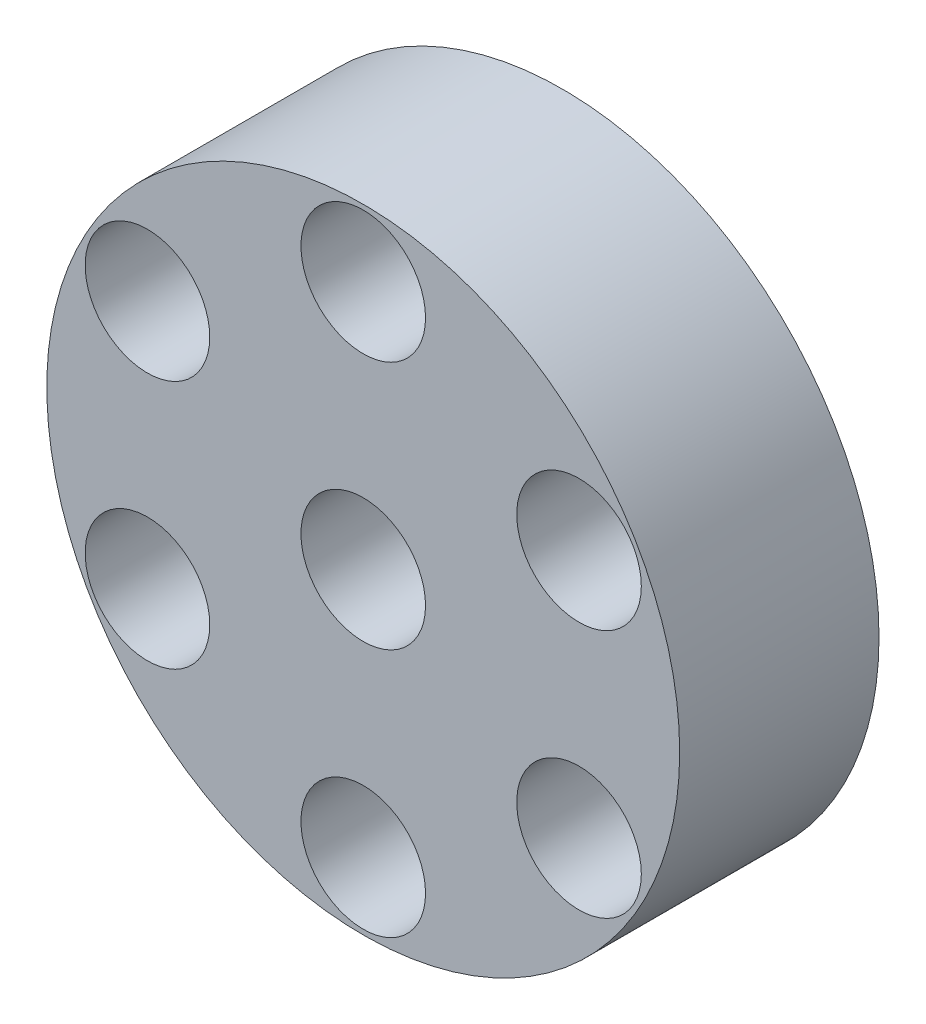
ISO-10303-21;
HEADER;
FILE_DESCRIPTION(('STEP AP214'),'2;1');
FILE_NAME('part.step','',(''),(''),'','','');
FILE_SCHEMA(('AUTOMOTIVE_DESIGN { 1 0 10303 214 1 1 1 1 }'));
ENDSEC;
DATA;
#1=APPLICATION_CONTEXT('core data for automotive mechanical design processes');
#2=APPLICATION_PROTOCOL_DEFINITION('international standard','automotive_design',2000,#1);
#3=PRODUCT_CONTEXT('',#1,'mechanical');
#4=PRODUCT('Part','Part','',(#3));
#5=PRODUCT_RELATED_PRODUCT_CATEGORY('part','',(#4));
#6=PRODUCT_DEFINITION_FORMATION('','',#4);
#7=PRODUCT_DEFINITION_CONTEXT('part definition',#1,'design');
#8=PRODUCT_DEFINITION('design','',#6,#7);
#9=PRODUCT_DEFINITION_SHAPE('','',#8);
#10=(LENGTH_UNIT() NAMED_UNIT(*) SI_UNIT(.MILLI.,.METRE.));
#11=(NAMED_UNIT(*) PLANE_ANGLE_UNIT() SI_UNIT($,.RADIAN.));
#12=(NAMED_UNIT(*) SI_UNIT($,.STERADIAN.) SOLID_ANGLE_UNIT());
#13=UNCERTAINTY_MEASURE_WITH_UNIT(LENGTH_MEASURE(1.E-05),#10,'distance_accuracy_value','');
#14=(GEOMETRIC_REPRESENTATION_CONTEXT(3) GLOBAL_UNCERTAINTY_ASSIGNED_CONTEXT((#13)) GLOBAL_UNIT_ASSIGNED_CONTEXT((#10,
#11,#12)) REPRESENTATION_CONTEXT('',''));
#15=CARTESIAN_POINT('',(0.,0.,0.));
#16=DIRECTION('',(0.,0.,1.));
#17=DIRECTION('',(1.,0.,0.));
#18=AXIS2_PLACEMENT_3D('',#15,#16,#17);
#19=CARTESIAN_POINT('',(0.,0.,8.));
#20=DIRECTION('',(0.,0.,-1.));
#21=DIRECTION('',(-1.,0.,0.));
#22=AXIS2_PLACEMENT_3D('',#19,#20,#21);
#23=CYLINDRICAL_SURFACE('',#22,12.7);
#24=CARTESIAN_POINT('',(0.,0.,8.));
#25=DIRECTION('',(0.,0.,1.));
#26=DIRECTION('',(1.,0.,0.));
#27=AXIS2_PLACEMENT_3D('',#24,#25,#26);
#28=CIRCLE('',#27,12.7);
#29=CARTESIAN_POINT('',(12.7,0.,8.));
#30=VERTEX_POINT('',#29);
#31=EDGE_CURVE('E10',#30,#30,#28,.T.);
#32=ORIENTED_EDGE('',*,*,#31,.F.);
#33=EDGE_LOOP('',(#32));
#34=FACE_BOUND('',#33,.T.);
#35=CARTESIAN_POINT('',(0.,0.,0.));
#36=DIRECTION('',(0.,0.,1.));
#37=DIRECTION('',(1.,0.,0.));
#38=AXIS2_PLACEMENT_3D('',#35,#36,#37);
#39=CIRCLE('',#38,12.7);
#40=CARTESIAN_POINT('',(12.7,0.,0.));
#41=VERTEX_POINT('',#40);
#42=EDGE_CURVE('E38',#41,#41,#39,.T.);
#43=ORIENTED_EDGE('',*,*,#42,.T.);
#44=EDGE_LOOP('',(#43));
#45=FACE_BOUND('',#44,.T.);
#46=ADVANCED_FACE('F35',(#34,#45),#23,.T.);
#47=CARTESIAN_POINT('',(0.,0.,8.));
#48=DIRECTION('',(0.,0.,1.));
#49=DIRECTION('',(1.,0.,0.));
#50=AXIS2_PLACEMENT_3D('',#47,#48,#49);
#51=PLANE('',#50);
#52=CARTESIAN_POINT('',(-8.66025403784425,4.99999999999975,8.));
#53=DIRECTION('',(0.,0.,1.));
#54=DIRECTION('',(1.,0.,0.));
#55=AXIS2_PLACEMENT_3D('',#52,#53,#54);
#56=CIRCLE('',#55,2.50000000000033);
#57=CARTESIAN_POINT('',(-6.16025403784392,4.99999999999975,8.));
#58=VERTEX_POINT('',#57);
#59=EDGE_CURVE('E56',#58,#58,#56,.T.);
#60=ORIENTED_EDGE('',*,*,#59,.F.);
#61=EDGE_LOOP('',(#60));
#62=FACE_BOUND('',#61,.T.);
#63=CARTESIAN_POINT('',(-8.66025403784396,-5.00000000000025,8.));
#64=DIRECTION('',(0.,0.,1.));
#65=DIRECTION('',(1.,0.,0.));
#66=AXIS2_PLACEMENT_3D('',#63,#64,#65);
#67=CIRCLE('',#66,2.50000000000057);
#68=CARTESIAN_POINT('',(-6.16025403784339,-5.00000000000025,8.));
#69=VERTEX_POINT('',#68);
#70=EDGE_CURVE('E62',#69,#69,#67,.T.);
#71=ORIENTED_EDGE('',*,*,#70,.F.);
#72=EDGE_LOOP('',(#71));
#73=FACE_BOUND('',#72,.T.);
#74=CARTESIAN_POINT('',(0.,0.,8.));
#75=DIRECTION('',(0.,0.,1.));
#76=DIRECTION('',(1.,0.,0.));
#77=AXIS2_PLACEMENT_3D('',#74,#75,#76);
#78=CIRCLE('',#77,2.5);
#79=CARTESIAN_POINT('',(2.5,0.,8.));
#80=VERTEX_POINT('',#79);
#81=EDGE_CURVE('E50',#80,#80,#78,.T.);
#82=ORIENTED_EDGE('',*,*,#81,.F.);
#83=EDGE_LOOP('',(#82));
#84=FACE_BOUND('',#83,.T.);
#85=CARTESIAN_POINT('',(8.66025403784453,5.00000000000025,8.));
#86=DIRECTION('',(0.,0.,1.));
#87=DIRECTION('',(1.,0.,0.));
#88=AXIS2_PLACEMENT_3D('',#85,#86,#87);
#89=CIRCLE('',#88,2.50000000000009);
#90=CARTESIAN_POINT('',(11.1602540378446,5.00000000000025,8.));
#91=VERTEX_POINT('',#90);
#92=EDGE_CURVE('E69',#91,#91,#89,.T.);
#93=ORIENTED_EDGE('',*,*,#92,.F.);
#94=EDGE_LOOP('',(#93));
#95=FACE_BOUND('',#94,.T.);
#96=CARTESIAN_POINT('',(8.66025403784481,-4.99999999999975,8.));
#97=DIRECTION('',(0.,0.,1.));
#98=DIRECTION('',(1.,0.,0.));
#99=AXIS2_PLACEMENT_3D('',#96,#97,#98);
#100=CIRCLE('',#99,2.50000000000038);
#101=CARTESIAN_POINT('',(11.1602540378452,-4.99999999999975,8.));
#102=VERTEX_POINT('',#101);
#103=EDGE_CURVE('E70',#102,#102,#100,.T.);
#104=ORIENTED_EDGE('',*,*,#103,.F.);
#105=EDGE_LOOP('',(#104));
#106=FACE_BOUND('',#105,.T.);
#107=CARTESIAN_POINT('',(5.65984895009786E-13,-10.,8.));
#108=DIRECTION('',(0.,0.,1.));
#109=DIRECTION('',(1.,0.,0.));
#110=AXIS2_PLACEMENT_3D('',#107,#108,#109);
#111=CIRCLE('',#110,2.50000000000061);
#112=CARTESIAN_POINT('',(2.50000000000118,-10.,8.));
#113=VERTEX_POINT('',#112);
#114=EDGE_CURVE('E80',#113,#113,#111,.T.);
#115=ORIENTED_EDGE('',*,*,#114,.F.);
#116=EDGE_LOOP('',(#115));
#117=FACE_BOUND('',#116,.T.);
#118=CARTESIAN_POINT('',(0.,10.,8.));
#119=DIRECTION('',(0.,0.,1.));
#120=DIRECTION('',(1.,0.,0.));
#121=AXIS2_PLACEMENT_3D('',#118,#119,#120);
#122=CIRCLE('',#121,2.5);
#123=CARTESIAN_POINT('',(2.5,10.,8.));
#124=VERTEX_POINT('',#123);
#125=EDGE_CURVE('E47',#124,#124,#122,.T.);
#126=ORIENTED_EDGE('',*,*,#125,.F.);
#127=EDGE_LOOP('',(#126));
#128=FACE_BOUND('',#127,.T.);
#129=ORIENTED_EDGE('',*,*,#31,.T.);
#130=EDGE_LOOP('',(#129));
#131=FACE_BOUND('',#130,.T.);
#132=ADVANCED_FACE('F91',(#62,#73,#84,#95,#106,#117,#128,#131),#51,.T.);
#133=CARTESIAN_POINT('',(0.,0.,0.));
#134=DIRECTION('',(0.,0.,1.));
#135=DIRECTION('',(1.,0.,0.));
#136=AXIS2_PLACEMENT_3D('',#133,#134,#135);
#137=PLANE('',#136);
#138=CARTESIAN_POINT('',(-8.66025403784425,4.99999999999975,0.));
#139=DIRECTION('',(0.,0.,1.));
#140=DIRECTION('',(1.,0.,0.));
#141=AXIS2_PLACEMENT_3D('',#138,#139,#140);
#142=CIRCLE('',#141,2.50000000000033);
#143=CARTESIAN_POINT('',(-6.16025403784392,4.99999999999975,0.));
#144=VERTEX_POINT('',#143);
#145=EDGE_CURVE('E53',#144,#144,#142,.T.);
#146=ORIENTED_EDGE('',*,*,#145,.T.);
#147=EDGE_LOOP('',(#146));
#148=FACE_BOUND('',#147,.T.);
#149=CARTESIAN_POINT('',(-8.66025403784396,-5.00000000000025,0.));
#150=DIRECTION('',(0.,0.,1.));
#151=DIRECTION('',(1.,0.,0.));
#152=AXIS2_PLACEMENT_3D('',#149,#150,#151);
#153=CIRCLE('',#152,2.50000000000057);
#154=CARTESIAN_POINT('',(-6.16025403784339,-5.00000000000025,0.));
#155=VERTEX_POINT('',#154);
#156=EDGE_CURVE('E59',#155,#155,#153,.T.);
#157=ORIENTED_EDGE('',*,*,#156,.T.);
#158=EDGE_LOOP('',(#157));
#159=FACE_BOUND('',#158,.T.);
#160=CARTESIAN_POINT('',(0.,0.,0.));
#161=DIRECTION('',(0.,0.,1.));
#162=DIRECTION('',(1.,0.,0.));
#163=AXIS2_PLACEMENT_3D('',#160,#161,#162);
#164=CIRCLE('',#163,2.5);
#165=CARTESIAN_POINT('',(2.5,0.,0.));
#166=VERTEX_POINT('',#165);
#167=EDGE_CURVE('E73',#166,#166,#164,.T.);
#168=ORIENTED_EDGE('',*,*,#167,.T.);
#169=EDGE_LOOP('',(#168));
#170=FACE_BOUND('',#169,.T.);
#171=CARTESIAN_POINT('',(8.66025403784453,5.00000000000025,0.));
#172=DIRECTION('',(0.,0.,1.));
#173=DIRECTION('',(1.,0.,0.));
#174=AXIS2_PLACEMENT_3D('',#171,#172,#173);
#175=CIRCLE('',#174,2.50000000000009);
#176=CARTESIAN_POINT('',(11.1602540378446,5.00000000000025,0.));
#177=VERTEX_POINT('',#176);
#178=EDGE_CURVE('E66',#177,#177,#175,.T.);
#179=ORIENTED_EDGE('',*,*,#178,.T.);
#180=EDGE_LOOP('',(#179));
#181=FACE_BOUND('',#180,.T.);
#182=CARTESIAN_POINT('',(8.66025403784481,-4.99999999999975,0.));
#183=DIRECTION('',(0.,0.,1.));
#184=DIRECTION('',(1.,0.,0.));
#185=AXIS2_PLACEMENT_3D('',#182,#183,#184);
#186=CIRCLE('',#185,2.50000000000038);
#187=CARTESIAN_POINT('',(11.1602540378452,-4.99999999999975,0.));
#188=VERTEX_POINT('',#187);
#189=EDGE_CURVE('E83',#188,#188,#186,.T.);
#190=ORIENTED_EDGE('',*,*,#189,.T.);
#191=EDGE_LOOP('',(#190));
#192=FACE_BOUND('',#191,.T.);
#193=CARTESIAN_POINT('',(5.65984895009786E-13,-10.,0.));
#194=DIRECTION('',(0.,0.,1.));
#195=DIRECTION('',(1.,0.,0.));
#196=AXIS2_PLACEMENT_3D('',#193,#194,#195);
#197=CIRCLE('',#196,2.50000000000061);
#198=CARTESIAN_POINT('',(2.50000000000118,-10.,0.));
#199=VERTEX_POINT('',#198);
#200=EDGE_CURVE('E65',#199,#199,#197,.T.);
#201=ORIENTED_EDGE('',*,*,#200,.T.);
#202=EDGE_LOOP('',(#201));
#203=FACE_BOUND('',#202,.T.);
#204=CARTESIAN_POINT('',(0.,10.,0.));
#205=DIRECTION('',(0.,0.,1.));
#206=DIRECTION('',(1.,0.,0.));
#207=AXIS2_PLACEMENT_3D('',#204,#205,#206);
#208=CIRCLE('',#207,2.5);
#209=CARTESIAN_POINT('',(2.5,10.,0.));
#210=VERTEX_POINT('',#209);
#211=EDGE_CURVE('E45',#210,#210,#208,.T.);
#212=ORIENTED_EDGE('',*,*,#211,.T.);
#213=EDGE_LOOP('',(#212));
#214=FACE_BOUND('',#213,.T.);
#215=ORIENTED_EDGE('',*,*,#42,.F.);
#216=EDGE_LOOP('',(#215));
#217=FACE_BOUND('',#216,.T.);
#218=ADVANCED_FACE('F94',(#148,#159,#170,#181,#192,#203,#214,#217),#137,.F.);
#219=CARTESIAN_POINT('',(0.,10.,0.));
#220=DIRECTION('',(0.,0.,1.));
#221=DIRECTION('',(1.,0.,0.));
#222=AXIS2_PLACEMENT_3D('',#219,#220,#221);
#223=CYLINDRICAL_SURFACE('',#222,2.5);
#224=ORIENTED_EDGE('',*,*,#211,.F.);
#225=EDGE_LOOP('',(#224));
#226=FACE_BOUND('',#225,.T.);
#227=ORIENTED_EDGE('',*,*,#125,.T.);
#228=EDGE_LOOP('',(#227));
#229=FACE_BOUND('',#228,.T.);
#230=ADVANCED_FACE('F101',(#226,#229),#223,.F.);
#231=CARTESIAN_POINT('',(5.65984895009786E-13,-10.,0.));
#232=DIRECTION('',(0.,0.,1.));
#233=DIRECTION('',(1.,0.,0.));
#234=AXIS2_PLACEMENT_3D('',#231,#232,#233);
#235=CYLINDRICAL_SURFACE('',#234,2.50000000000061);
#236=ORIENTED_EDGE('',*,*,#200,.F.);
#237=EDGE_LOOP('',(#236));
#238=FACE_BOUND('',#237,.T.);
#239=ORIENTED_EDGE('',*,*,#114,.T.);
#240=EDGE_LOOP('',(#239));
#241=FACE_BOUND('',#240,.T.);
#242=ADVANCED_FACE('F103',(#238,#241),#235,.F.);
#243=CARTESIAN_POINT('',(8.66025403784481,-4.99999999999975,0.));
#244=DIRECTION('',(0.,0.,1.));
#245=DIRECTION('',(1.,0.,0.));
#246=AXIS2_PLACEMENT_3D('',#243,#244,#245);
#247=CYLINDRICAL_SURFACE('',#246,2.50000000000038);
#248=ORIENTED_EDGE('',*,*,#189,.F.);
#249=EDGE_LOOP('',(#248));
#250=FACE_BOUND('',#249,.T.);
#251=ORIENTED_EDGE('',*,*,#103,.T.);
#252=EDGE_LOOP('',(#251));
#253=FACE_BOUND('',#252,.T.);
#254=ADVANCED_FACE('F89',(#250,#253),#247,.F.);
#255=CARTESIAN_POINT('',(8.66025403784453,5.00000000000025,0.));
#256=DIRECTION('',(0.,0.,1.));
#257=DIRECTION('',(1.,0.,0.));
#258=AXIS2_PLACEMENT_3D('',#255,#256,#257);
#259=CYLINDRICAL_SURFACE('',#258,2.50000000000009);
#260=ORIENTED_EDGE('',*,*,#178,.F.);
#261=EDGE_LOOP('',(#260));
#262=FACE_BOUND('',#261,.T.);
#263=ORIENTED_EDGE('',*,*,#92,.T.);
#264=EDGE_LOOP('',(#263));
#265=FACE_BOUND('',#264,.T.);
#266=ADVANCED_FACE('F152',(#262,#265),#259,.F.);
#267=CARTESIAN_POINT('',(0.,0.,0.));
#268=DIRECTION('',(0.,0.,1.));
#269=DIRECTION('',(1.,0.,0.));
#270=AXIS2_PLACEMENT_3D('',#267,#268,#269);
#271=CYLINDRICAL_SURFACE('',#270,2.5);
#272=ORIENTED_EDGE('',*,*,#167,.F.);
#273=EDGE_LOOP('',(#272));
#274=FACE_BOUND('',#273,.T.);
#275=ORIENTED_EDGE('',*,*,#81,.T.);
#276=EDGE_LOOP('',(#275));
#277=FACE_BOUND('',#276,.T.);
#278=ADVANCED_FACE('F163',(#274,#277),#271,.F.);
#279=CARTESIAN_POINT('',(-8.66025403784396,-5.00000000000025,0.));
#280=DIRECTION('',(0.,0.,1.));
#281=DIRECTION('',(1.,0.,0.));
#282=AXIS2_PLACEMENT_3D('',#279,#280,#281);
#283=CYLINDRICAL_SURFACE('',#282,2.50000000000057);
#284=ORIENTED_EDGE('',*,*,#156,.F.);
#285=EDGE_LOOP('',(#284));
#286=FACE_BOUND('',#285,.T.);
#287=ORIENTED_EDGE('',*,*,#70,.T.);
#288=EDGE_LOOP('',(#287));
#289=FACE_BOUND('',#288,.T.);
#290=ADVANCED_FACE('F174',(#286,#289),#283,.F.);
#291=CARTESIAN_POINT('',(-8.66025403784425,4.99999999999975,0.));
#292=DIRECTION('',(0.,0.,1.));
#293=DIRECTION('',(1.,0.,0.));
#294=AXIS2_PLACEMENT_3D('',#291,#292,#293);
#295=CYLINDRICAL_SURFACE('',#294,2.50000000000033);
#296=ORIENTED_EDGE('',*,*,#145,.F.);
#297=EDGE_LOOP('',(#296));
#298=FACE_BOUND('',#297,.T.);
#299=ORIENTED_EDGE('',*,*,#59,.T.);
#300=EDGE_LOOP('',(#299));
#301=FACE_BOUND('',#300,.T.);
#302=ADVANCED_FACE('F185',(#298,#301),#295,.F.);
#303=CLOSED_SHELL('',(#46,#132,#218,#230,#242,#254,#266,#278,#290,#302));
#304=MANIFOLD_SOLID_BREP('B2',#303);
#305=ADVANCED_BREP_SHAPE_REPRESENTATION('',(#18,#304),#14);
#306=SHAPE_DEFINITION_REPRESENTATION(#9,#305);
ENDSEC;
END-ISO-10303-21;
